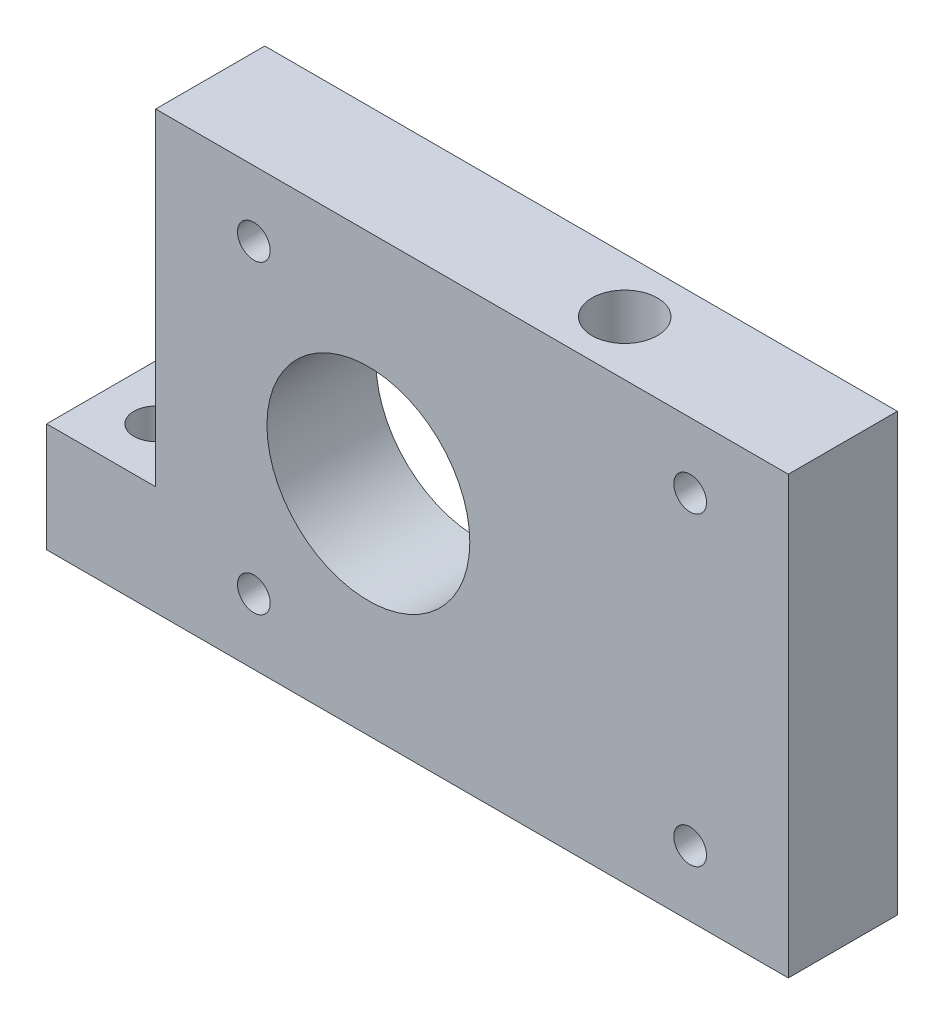
ISO-10303-21;
HEADER;
FILE_DESCRIPTION(('STEP AP214'),'2;1');
FILE_NAME('part.step','',(''),(''),'','','');
FILE_SCHEMA(('AUTOMOTIVE_DESIGN { 1 0 10303 214 1 1 1 1 }'));
ENDSEC;
DATA;
#1=APPLICATION_CONTEXT('core data for automotive mechanical design processes');
#2=APPLICATION_PROTOCOL_DEFINITION('international standard','automotive_design',2000,#1);
#3=PRODUCT_CONTEXT('',#1,'mechanical');
#4=PRODUCT('Part','Part','',(#3));
#5=PRODUCT_RELATED_PRODUCT_CATEGORY('part','',(#4));
#6=PRODUCT_DEFINITION_FORMATION('','',#4);
#7=PRODUCT_DEFINITION_CONTEXT('part definition',#1,'design');
#8=PRODUCT_DEFINITION('design','',#6,#7);
#9=PRODUCT_DEFINITION_SHAPE('','',#8);
#10=(LENGTH_UNIT() NAMED_UNIT(*) SI_UNIT(.MILLI.,.METRE.));
#11=(NAMED_UNIT(*) PLANE_ANGLE_UNIT() SI_UNIT($,.RADIAN.));
#12=(NAMED_UNIT(*) SI_UNIT($,.STERADIAN.) SOLID_ANGLE_UNIT());
#13=UNCERTAINTY_MEASURE_WITH_UNIT(LENGTH_MEASURE(1.E-05),#10,'distance_accuracy_value','');
#14=(GEOMETRIC_REPRESENTATION_CONTEXT(3) GLOBAL_UNCERTAINTY_ASSIGNED_CONTEXT((#13)) GLOBAL_UNIT_ASSIGNED_CONTEXT((#10,
#11,#12)) REPRESENTATION_CONTEXT('',''));
#15=CARTESIAN_POINT('',(0.,0.,0.));
#16=DIRECTION('',(0.,0.,1.));
#17=DIRECTION('',(1.,0.,0.));
#18=AXIS2_PLACEMENT_3D('',#15,#16,#17);
#19=CARTESIAN_POINT('',(-49.,7.8359502095322,21.0924178005195));
#20=DIRECTION('',(0.,0.,-1.));
#21=DIRECTION('',(-1.,0.,0.));
#22=AXIS2_PLACEMENT_3D('',#19,#20,#21);
#23=CYLINDRICAL_SURFACE('',#22,3.9);
#24=CARTESIAN_POINT('',(-49.,7.8359502095322,0.));
#25=DIRECTION('',(0.,0.,1.));
#26=DIRECTION('',(1.,0.,0.));
#27=AXIS2_PLACEMENT_3D('',#24,#25,#26);
#28=CIRCLE('',#27,3.9);
#29=CARTESIAN_POINT('',(-45.1,7.8359502095322,0.));
#30=VERTEX_POINT('',#29);
#31=EDGE_CURVE('E278',#30,#30,#28,.T.);
#32=ORIENTED_EDGE('',*,*,#31,.T.);
#33=EDGE_LOOP('',(#32));
#34=FACE_BOUND('',#33,.T.);
#35=CARTESIAN_POINT('',(-49.,7.8359502095322,0.0615520140093105));
#36=DIRECTION('',(0.,0.,1.));
#37=DIRECTION('',(1.,0.,0.));
#38=AXIS2_PLACEMENT_3D('',#35,#36,#37);
#39=CIRCLE('',#38,3.9);
#40=CARTESIAN_POINT('',(-45.1,7.8359502095322,0.061552014009314));
#41=VERTEX_POINT('',#40);
#42=EDGE_CURVE('E12',#41,#41,#39,.T.);
#43=ORIENTED_EDGE('',*,*,#42,.F.);
#44=EDGE_LOOP('',(#43));
#45=FACE_BOUND('',#44,.T.);
#46=ADVANCED_FACE('F110',(#34,#45),#23,.T.);
#47=CARTESIAN_POINT('',(-49.,7.8359502095322,0.));
#48=DIRECTION('',(0.,0.,1.));
#49=DIRECTION('',(1.,0.,0.));
#50=AXIS2_PLACEMENT_3D('',#47,#48,#49);
#51=PLANE('',#50);
#52=ORIENTED_EDGE('',*,*,#31,.F.);
#53=EDGE_LOOP('',(#52));
#54=FACE_BOUND('',#53,.T.);
#55=CARTESIAN_POINT('',(-49.,7.8359502095322,0.));
#56=DIRECTION('',(0.,0.,1.));
#57=DIRECTION('',(1.,0.,0.));
#58=AXIS2_PLACEMENT_3D('',#55,#56,#57);
#59=CIRCLE('',#58,1.5);
#60=CARTESIAN_POINT('',(-47.5,7.8359502095322,0.));
#61=VERTEX_POINT('',#60);
#62=EDGE_CURVE('E274',#61,#61,#59,.T.);
#63=ORIENTED_EDGE('',*,*,#62,.T.);
#64=EDGE_LOOP('',(#63));
#65=FACE_BOUND('',#64,.T.);
#66=ADVANCED_FACE('F291',(#54,#65),#51,.F.);
#67=CARTESIAN_POINT('',(-49.,7.8359502095322,21.0924178005195));
#68=DIRECTION('',(0.,0.,-1.));
#69=DIRECTION('',(-1.,0.,0.));
#70=AXIS2_PLACEMENT_3D('',#67,#68,#69);
#71=CYLINDRICAL_SURFACE('',#70,1.5);
#72=CARTESIAN_POINT('',(-49.,7.8359502095322,10.0615520140093));
#73=DIRECTION('',(0.,0.,-1.));
#74=DIRECTION('',(-1.,0.,0.));
#75=AXIS2_PLACEMENT_3D('',#72,#73,#74);
#76=CIRCLE('',#75,1.5);
#77=CARTESIAN_POINT('',(-50.5,7.8359502095322,10.0615520140093));
#78=VERTEX_POINT('',#77);
#79=EDGE_CURVE('E119',#78,#78,#76,.T.);
#80=ORIENTED_EDGE('',*,*,#79,.F.);
#81=EDGE_LOOP('',(#80));
#82=FACE_BOUND('',#81,.T.);
#83=ORIENTED_EDGE('',*,*,#62,.F.);
#84=EDGE_LOOP('',(#83));
#85=FACE_BOUND('',#84,.T.);
#86=ADVANCED_FACE('F288',(#82,#85),#71,.F.);
#87=CARTESIAN_POINT('',(59.0127496167088,10.0697952356252,10.0615520140094));
#88=DIRECTION('',(0.,0.,-1.));
#89=DIRECTION('',(0.906307787036651,0.422618261740697,0.));
#90=AXIS2_PLACEMENT_3D('',#87,#88,#89);
#91=PLANE('',#90);
#92=ORIENTED_EDGE('',*,*,#79,.T.);
#93=EDGE_LOOP('',(#92));
#94=FACE_BOUND('',#93,.T.);
#95=DIRECTION('',(1.,0.,0.));
#96=VECTOR('',#95,1.);
#97=CARTESIAN_POINT('',(59.0127496167088,1.83595020953221,10.0615520140094));
#98=LINE('',#97,#96);
#99=CARTESIAN_POINT('',(-68.,1.83595020952963,10.0615520140094));
#100=VERTEX_POINT('',#99);
#101=CARTESIAN_POINT('',(0.,1.8359502095322,10.0615520140094));
#102=VERTEX_POINT('',#101);
#103=EDGE_CURVE('E255',#100,#102,#98,.T.);
#104=ORIENTED_EDGE('',*,*,#103,.T.);
#105=DIRECTION('',(0.,1.,0.));
#106=VECTOR('',#105,1.);
#107=CARTESIAN_POINT('',(0.,10.0697952356252,10.0615520140094));
#108=LINE('',#107,#106);
#109=CARTESIAN_POINT('',(0.,41.8359502095322,10.0615520140094));
#110=VERTEX_POINT('',#109);
#111=EDGE_CURVE('E267',#102,#110,#108,.T.);
#112=ORIENTED_EDGE('',*,*,#111,.T.);
#113=DIRECTION('',(-1.,0.,0.));
#114=VECTOR('',#113,1.);
#115=CARTESIAN_POINT('',(59.0127496167088,41.8359502095322,10.0615520140094));
#116=LINE('',#115,#114);
#117=CARTESIAN_POINT('',(-58.,41.8359502095322,10.0615520140093));
#118=VERTEX_POINT('',#117);
#119=EDGE_CURVE('E270',#110,#118,#116,.T.);
#120=ORIENTED_EDGE('',*,*,#119,.T.);
#121=DIRECTION('',(0.,-1.,0.));
#122=VECTOR('',#121,1.);
#123=CARTESIAN_POINT('',(-58.,10.0697952356252,10.0615520140093));
#124=LINE('',#123,#122);
#125=CARTESIAN_POINT('',(-58.,11.8359502095296,10.0615520140093));
#126=VERTEX_POINT('',#125);
#127=EDGE_CURVE('E262',#118,#126,#124,.T.);
#128=ORIENTED_EDGE('',*,*,#127,.T.);
#129=DIRECTION('',(1.,0.,0.));
#130=VECTOR('',#129,1.);
#131=CARTESIAN_POINT('',(-58.,11.8359502095296,10.0615520140094));
#132=LINE('',#131,#130);
#133=CARTESIAN_POINT('',(-68.,11.8359502095296,10.0615520140094));
#134=VERTEX_POINT('',#133);
#135=EDGE_CURVE('E190',#134,#126,#132,.T.);
#136=ORIENTED_EDGE('',*,*,#135,.F.);
#137=DIRECTION('',(0.,-1.,0.));
#138=VECTOR('',#137,1.);
#139=CARTESIAN_POINT('',(-68.,11.8359502095296,10.0615520140094));
#140=LINE('',#139,#138);
#141=EDGE_CURVE('E201',#134,#100,#140,.T.);
#142=ORIENTED_EDGE('',*,*,#141,.T.);
#143=EDGE_LOOP('',(#104,#112,#120,#128,#136,#142));
#144=FACE_BOUND('',#143,.T.);
#145=CARTESIAN_POINT('',(-38.5,21.8359502095322,10.0615520140093));
#146=DIRECTION('',(0.,0.,-1.));
#147=DIRECTION('',(-1.,0.,0.));
#148=AXIS2_PLACEMENT_3D('',#145,#146,#147);
#149=CIRCLE('',#148,9.3);
#150=CARTESIAN_POINT('',(-47.8,21.8359502095322,10.0615520140093));
#151=VERTEX_POINT('',#150);
#152=EDGE_CURVE('E251',#151,#151,#149,.T.);
#153=ORIENTED_EDGE('',*,*,#152,.T.);
#154=EDGE_LOOP('',(#153));
#155=FACE_BOUND('',#154,.T.);
#156=CARTESIAN_POINT('',(-49.,35.8359502095322,10.0615520140093));
#157=DIRECTION('',(0.,0.,-1.));
#158=DIRECTION('',(-1.,0.,0.));
#159=AXIS2_PLACEMENT_3D('',#156,#157,#158);
#160=CIRCLE('',#159,1.5);
#161=CARTESIAN_POINT('',(-50.5,35.8359502095322,10.0615520140093));
#162=VERTEX_POINT('',#161);
#163=EDGE_CURVE('E237',#162,#162,#160,.T.);
#164=ORIENTED_EDGE('',*,*,#163,.T.);
#165=EDGE_LOOP('',(#164));
#166=FACE_BOUND('',#165,.T.);
#167=CARTESIAN_POINT('',(-9.,35.8359502095322,10.0615520140093));
#168=DIRECTION('',(0.,0.,-1.));
#169=DIRECTION('',(-1.,0.,0.));
#170=AXIS2_PLACEMENT_3D('',#167,#168,#169);
#171=CIRCLE('',#170,1.5);
#172=CARTESIAN_POINT('',(-10.5,35.8359502095322,10.0615520140093));
#173=VERTEX_POINT('',#172);
#174=EDGE_CURVE('E228',#173,#173,#171,.T.);
#175=ORIENTED_EDGE('',*,*,#174,.T.);
#176=EDGE_LOOP('',(#175));
#177=FACE_BOUND('',#176,.T.);
#178=CARTESIAN_POINT('',(-9.,7.8359502095322,10.0615520140093));
#179=DIRECTION('',(0.,0.,-1.));
#180=DIRECTION('',(-1.,0.,0.));
#181=AXIS2_PLACEMENT_3D('',#178,#179,#180);
#182=CIRCLE('',#181,1.5);
#183=CARTESIAN_POINT('',(-10.5,7.8359502095322,10.0615520140093));
#184=VERTEX_POINT('',#183);
#185=EDGE_CURVE('E219',#184,#184,#182,.T.);
#186=ORIENTED_EDGE('',*,*,#185,.T.);
#187=EDGE_LOOP('',(#186));
#188=FACE_BOUND('',#187,.T.);
#189=ADVANCED_FACE('F112',(#94,#144,#155,#166,#177,#188),#91,.F.);
#190=CARTESIAN_POINT('',(0.,0.,0.0615520140093539));
#191=DIRECTION('',(0.,0.,1.));
#192=DIRECTION('',(1.,0.,0.));
#193=AXIS2_PLACEMENT_3D('',#190,#191,#192);
#194=PLANE('',#193);
#195=DIRECTION('',(1.,0.,0.));
#196=VECTOR('',#195,1.);
#197=CARTESIAN_POINT('',(59.0127496167088,1.83595020953221,0.0615520140094059));
#198=LINE('',#197,#196);
#199=CARTESIAN_POINT('',(-68.,1.83595020952963,0.0615520140093031));
#200=VERTEX_POINT('',#199);
#201=CARTESIAN_POINT('',(0.,1.8359502095322,0.0615520140093539));
#202=VERTEX_POINT('',#201);
#203=EDGE_CURVE('E258',#200,#202,#198,.T.);
#204=ORIENTED_EDGE('',*,*,#203,.F.);
#205=DIRECTION('',(0.,-1.,0.));
#206=VECTOR('',#205,1.);
#207=CARTESIAN_POINT('',(-68.,11.8359502095296,0.0615520140093031));
#208=LINE('',#207,#206);
#209=CARTESIAN_POINT('',(-68.,11.8359502095296,0.0615520140093031));
#210=VERTEX_POINT('',#209);
#211=EDGE_CURVE('E181',#210,#200,#208,.T.);
#212=ORIENTED_EDGE('',*,*,#211,.F.);
#213=DIRECTION('',(-1.,0.,0.));
#214=VECTOR('',#213,1.);
#215=CARTESIAN_POINT('',(-58.,11.8359502095296,0.0615520140093018));
#216=LINE('',#215,#214);
#217=CARTESIAN_POINT('',(-58.,11.8359502095296,0.0615520140093018));
#218=VERTEX_POINT('',#217);
#219=EDGE_CURVE('E177',#218,#210,#216,.T.);
#220=ORIENTED_EDGE('',*,*,#219,.F.);
#221=DIRECTION('',(0.,-1.,0.));
#222=VECTOR('',#221,1.);
#223=CARTESIAN_POINT('',(-58.,10.0697952356252,0.0615520140093018));
#224=LINE('',#223,#222);
#225=CARTESIAN_POINT('',(-58.,41.8359502095322,0.0615520140093001));
#226=VERTEX_POINT('',#225);
#227=EDGE_CURVE('E169',#226,#218,#224,.T.);
#228=ORIENTED_EDGE('',*,*,#227,.F.);
#229=DIRECTION('',(-1.,0.,0.));
#230=VECTOR('',#229,1.);
#231=CARTESIAN_POINT('',(59.0127496167088,41.8359502095322,0.0615520140094042));
#232=LINE('',#231,#230);
#233=CARTESIAN_POINT('',(0.,41.8359502095322,0.0615520140093521));
#234=VERTEX_POINT('',#233);
#235=EDGE_CURVE('E174',#234,#226,#232,.T.);
#236=ORIENTED_EDGE('',*,*,#235,.F.);
#237=DIRECTION('',(0.,1.,0.));
#238=VECTOR('',#237,1.);
#239=CARTESIAN_POINT('',(0.,10.0697952356252,0.0615520140093539));
#240=LINE('',#239,#238);
#241=EDGE_CURVE('E261',#202,#234,#240,.T.);
#242=ORIENTED_EDGE('',*,*,#241,.F.);
#243=EDGE_LOOP('',(#204,#212,#220,#228,#236,#242));
#244=FACE_BOUND('',#243,.T.);
#245=CARTESIAN_POINT('',(-38.5,21.8359502095322,0.0615520140093192));
#246=DIRECTION('',(0.,0.,-1.));
#247=DIRECTION('',(-1.,0.,0.));
#248=AXIS2_PLACEMENT_3D('',#245,#246,#247);
#249=CIRCLE('',#248,9.3);
#250=CARTESIAN_POINT('',(-47.8,21.8359502095322,0.0615520140093109));
#251=VERTEX_POINT('',#250);
#252=EDGE_CURVE('E252',#251,#251,#249,.T.);
#253=ORIENTED_EDGE('',*,*,#252,.F.);
#254=EDGE_LOOP('',(#253));
#255=FACE_BOUND('',#254,.T.);
#256=CARTESIAN_POINT('',(-49.,35.8359502095322,0.0615520140093088));
#257=DIRECTION('',(0.,0.,-1.));
#258=DIRECTION('',(-1.,0.,0.));
#259=AXIS2_PLACEMENT_3D('',#256,#257,#258);
#260=CIRCLE('',#259,3.9);
#261=CARTESIAN_POINT('',(-52.9,35.8359502095322,0.0615520140093053));
#262=VERTEX_POINT('',#261);
#263=EDGE_CURVE('E248',#262,#262,#260,.T.);
#264=ORIENTED_EDGE('',*,*,#263,.F.);
#265=EDGE_LOOP('',(#264));
#266=FACE_BOUND('',#265,.T.);
#267=ORIENTED_EDGE('',*,*,#42,.T.);
#268=EDGE_LOOP('',(#267));
#269=FACE_BOUND('',#268,.T.);
#270=CARTESIAN_POINT('',(-9.00000000000001,35.8359502095322,0.0615520140093452));
#271=DIRECTION('',(0.,0.,-1.));
#272=DIRECTION('',(-1.,0.,0.));
#273=AXIS2_PLACEMENT_3D('',#270,#271,#272);
#274=CIRCLE('',#273,3.9);
#275=CARTESIAN_POINT('',(-12.9,35.8359502095322,0.0615520140093417));
#276=VERTEX_POINT('',#275);
#277=EDGE_CURVE('E245',#276,#276,#274,.T.);
#278=ORIENTED_EDGE('',*,*,#277,.F.);
#279=EDGE_LOOP('',(#278));
#280=FACE_BOUND('',#279,.T.);
#281=CARTESIAN_POINT('',(-8.99999999999999,7.83595020953221,0.0615520140093452));
#282=DIRECTION('',(0.,0.,-1.));
#283=DIRECTION('',(-1.,0.,0.));
#284=AXIS2_PLACEMENT_3D('',#281,#282,#283);
#285=CIRCLE('',#284,3.9);
#286=CARTESIAN_POINT('',(-12.9,7.83595020953221,0.0615520140093417));
#287=VERTEX_POINT('',#286);
#288=EDGE_CURVE('E242',#287,#287,#285,.T.);
#289=ORIENTED_EDGE('',*,*,#288,.F.);
#290=EDGE_LOOP('',(#289));
#291=FACE_BOUND('',#290,.T.);
#292=ADVANCED_FACE('F178',(#244,#255,#266,#269,#280,#291),#194,.F.);
#293=CARTESIAN_POINT('',(59.0127496167088,1.83595020953221,0.0615520140094059));
#294=DIRECTION('',(0.,-1.,0.));
#295=DIRECTION('',(1.,0.,0.));
#296=AXIS2_PLACEMENT_3D('',#293,#294,#295);
#297=PLANE('',#296);
#298=CARTESIAN_POINT('',(-20.,1.83595020953219,5.0615520140093));
#299=DIRECTION('',(0.,1.,0.));
#300=DIRECTION('',(-1.,0.,0.));
#301=AXIS2_PLACEMENT_3D('',#298,#299,#300);
#302=CIRCLE('',#301,2.);
#303=CARTESIAN_POINT('',(-22.,1.83595020953219,5.0615520140093));
#304=VERTEX_POINT('',#303);
#305=EDGE_CURVE('E206',#304,#304,#302,.T.);
#306=ORIENTED_EDGE('',*,*,#305,.T.);
#307=EDGE_LOOP('',(#306));
#308=FACE_BOUND('',#307,.T.);
#309=ORIENTED_EDGE('',*,*,#103,.F.);
#310=DIRECTION('',(0.,0.,1.));
#311=VECTOR('',#310,1.);
#312=CARTESIAN_POINT('',(-68.,1.83595020952963,0.0615520140093031));
#313=LINE('',#312,#311);
#314=EDGE_CURVE('E191',#200,#100,#313,.T.);
#315=ORIENTED_EDGE('',*,*,#314,.F.);
#316=ORIENTED_EDGE('',*,*,#203,.T.);
#317=DIRECTION('',(0.,0.,1.));
#318=VECTOR('',#317,1.);
#319=CARTESIAN_POINT('',(0.,1.8359502095322,0.0615520140093539));
#320=LINE('',#319,#318);
#321=EDGE_CURVE('E153',#202,#102,#320,.T.);
#322=ORIENTED_EDGE('',*,*,#321,.T.);
#323=EDGE_LOOP('',(#309,#315,#316,#322));
#324=FACE_BOUND('',#323,.T.);
#325=CARTESIAN_POINT('',(-63.,1.83595020952963,5.06155201400933));
#326=DIRECTION('',(0.,1.,0.));
#327=DIRECTION('',(-1.,0.,0.));
#328=AXIS2_PLACEMENT_3D('',#325,#326,#327);
#329=CIRCLE('',#328,2.);
#330=CARTESIAN_POINT('',(-65.,1.83595020952963,5.06155201400933));
#331=VERTEX_POINT('',#330);
#332=EDGE_CURVE('E197',#331,#331,#329,.T.);
#333=ORIENTED_EDGE('',*,*,#332,.T.);
#334=EDGE_LOOP('',(#333));
#335=FACE_BOUND('',#334,.T.);
#336=ADVANCED_FACE('F304',(#308,#324,#335),#297,.T.);
#337=CARTESIAN_POINT('',(-58.,10.0697952356252,0.0615520140093018));
#338=DIRECTION('',(-1.,0.,0.));
#339=DIRECTION('',(0.,-1.,0.));
#340=AXIS2_PLACEMENT_3D('',#337,#338,#339);
#341=PLANE('',#340);
#342=DIRECTION('',(0.,0.,-1.));
#343=VECTOR('',#342,1.);
#344=CARTESIAN_POINT('',(-58.,11.8359502095296,0.0615520140093018));
#345=LINE('',#344,#343);
#346=EDGE_CURVE('E126',#126,#218,#345,.T.);
#347=ORIENTED_EDGE('',*,*,#346,.F.);
#348=ORIENTED_EDGE('',*,*,#127,.F.);
#349=DIRECTION('',(0.,0.,1.));
#350=VECTOR('',#349,1.);
#351=CARTESIAN_POINT('',(-58.,41.8359502095322,0.0615520140093001));
#352=LINE('',#351,#350);
#353=EDGE_CURVE('E132',#226,#118,#352,.T.);
#354=ORIENTED_EDGE('',*,*,#353,.F.);
#355=ORIENTED_EDGE('',*,*,#227,.T.);
#356=EDGE_LOOP('',(#347,#348,#354,#355));
#357=FACE_BOUND('',#356,.T.);
#358=ADVANCED_FACE('F171',(#357),#341,.T.);
#359=CARTESIAN_POINT('',(59.0127496167088,41.8359502095322,0.0615520140094042));
#360=DIRECTION('',(0.,1.,0.));
#361=DIRECTION('',(-1.,0.,0.));
#362=AXIS2_PLACEMENT_3D('',#359,#360,#361);
#363=PLANE('',#362);
#364=CARTESIAN_POINT('',(-20.,41.8359502095322,5.0615520140093));
#365=DIRECTION('',(0.,1.,0.));
#366=DIRECTION('',(-1.,0.,0.));
#367=AXIS2_PLACEMENT_3D('',#364,#365,#366);
#368=CIRCLE('',#367,3.);
#369=CARTESIAN_POINT('',(-23.,41.8359502095322,5.0615520140093));
#370=VERTEX_POINT('',#369);
#371=EDGE_CURVE('E213',#370,#370,#368,.T.);
#372=ORIENTED_EDGE('',*,*,#371,.F.);
#373=EDGE_LOOP('',(#372));
#374=FACE_BOUND('',#373,.T.);
#375=ORIENTED_EDGE('',*,*,#119,.F.);
#376=DIRECTION('',(0.,0.,1.));
#377=VECTOR('',#376,1.);
#378=CARTESIAN_POINT('',(0.,41.8359502095322,0.0615520140093521));
#379=LINE('',#378,#377);
#380=EDGE_CURVE('E275',#234,#110,#379,.T.);
#381=ORIENTED_EDGE('',*,*,#380,.F.);
#382=ORIENTED_EDGE('',*,*,#235,.T.);
#383=ORIENTED_EDGE('',*,*,#353,.T.);
#384=EDGE_LOOP('',(#375,#381,#382,#383));
#385=FACE_BOUND('',#384,.T.);
#386=ADVANCED_FACE('F312',(#374,#385),#363,.T.);
#387=CARTESIAN_POINT('',(0.,10.0697952356252,0.0615520140093539));
#388=DIRECTION('',(1.,0.,0.));
#389=DIRECTION('',(0.,1.,0.));
#390=AXIS2_PLACEMENT_3D('',#387,#388,#389);
#391=PLANE('',#390);
#392=ORIENTED_EDGE('',*,*,#111,.F.);
#393=ORIENTED_EDGE('',*,*,#321,.F.);
#394=ORIENTED_EDGE('',*,*,#241,.T.);
#395=ORIENTED_EDGE('',*,*,#380,.T.);
#396=EDGE_LOOP('',(#392,#393,#394,#395));
#397=FACE_BOUND('',#396,.T.);
#398=ADVANCED_FACE('F308',(#397),#391,.T.);
#399=CARTESIAN_POINT('',(-38.5,21.8359502095322,0.0615520140093192));
#400=DIRECTION('',(0.,0.,1.));
#401=DIRECTION('',(1.,0.,0.));
#402=AXIS2_PLACEMENT_3D('',#399,#400,#401);
#403=CYLINDRICAL_SURFACE('',#402,9.3);
#404=ORIENTED_EDGE('',*,*,#252,.T.);
#405=EDGE_LOOP('',(#404));
#406=FACE_BOUND('',#405,.T.);
#407=ORIENTED_EDGE('',*,*,#152,.F.);
#408=EDGE_LOOP('',(#407));
#409=FACE_BOUND('',#408,.T.);
#410=ADVANCED_FACE('F311',(#406,#409),#403,.F.);
#411=CARTESIAN_POINT('',(-49.,35.8359502095322,21.0924178005195));
#412=DIRECTION('',(0.,0.,-1.));
#413=DIRECTION('',(-1.,0.,0.));
#414=AXIS2_PLACEMENT_3D('',#411,#412,#413);
#415=CYLINDRICAL_SURFACE('',#414,3.9);
#416=CARTESIAN_POINT('',(-49.,35.8359502095322,0.));
#417=DIRECTION('',(0.,0.,1.));
#418=DIRECTION('',(1.,0.,0.));
#419=AXIS2_PLACEMENT_3D('',#416,#417,#418);
#420=CIRCLE('',#419,3.9);
#421=CARTESIAN_POINT('',(-45.1,35.8359502095322,0.));
#422=VERTEX_POINT('',#421);
#423=EDGE_CURVE('E234',#422,#422,#420,.T.);
#424=ORIENTED_EDGE('',*,*,#423,.T.);
#425=EDGE_LOOP('',(#424));
#426=FACE_BOUND('',#425,.T.);
#427=ORIENTED_EDGE('',*,*,#263,.T.);
#428=EDGE_LOOP('',(#427));
#429=FACE_BOUND('',#428,.T.);
#430=ADVANCED_FACE('F322',(#426,#429),#415,.T.);
#431=CARTESIAN_POINT('',(-49.,35.8359502095322,0.));
#432=DIRECTION('',(0.,0.,1.));
#433=DIRECTION('',(1.,0.,0.));
#434=AXIS2_PLACEMENT_3D('',#431,#432,#433);
#435=PLANE('',#434);
#436=ORIENTED_EDGE('',*,*,#423,.F.);
#437=EDGE_LOOP('',(#436));
#438=FACE_BOUND('',#437,.T.);
#439=CARTESIAN_POINT('',(-49.,35.8359502095322,0.));
#440=DIRECTION('',(0.,0.,1.));
#441=DIRECTION('',(1.,0.,0.));
#442=AXIS2_PLACEMENT_3D('',#439,#440,#441);
#443=CIRCLE('',#442,1.5);
#444=CARTESIAN_POINT('',(-47.5,35.8359502095322,0.));
#445=VERTEX_POINT('',#444);
#446=EDGE_CURVE('E233',#445,#445,#443,.T.);
#447=ORIENTED_EDGE('',*,*,#446,.T.);
#448=EDGE_LOOP('',(#447));
#449=FACE_BOUND('',#448,.T.);
#450=ADVANCED_FACE('F328',(#438,#449),#435,.F.);
#451=CARTESIAN_POINT('',(-49.,35.8359502095322,21.0924178005195));
#452=DIRECTION('',(0.,0.,-1.));
#453=DIRECTION('',(-1.,0.,0.));
#454=AXIS2_PLACEMENT_3D('',#451,#452,#453);
#455=CYLINDRICAL_SURFACE('',#454,1.5);
#456=ORIENTED_EDGE('',*,*,#163,.F.);
#457=EDGE_LOOP('',(#456));
#458=FACE_BOUND('',#457,.T.);
#459=ORIENTED_EDGE('',*,*,#446,.F.);
#460=EDGE_LOOP('',(#459));
#461=FACE_BOUND('',#460,.T.);
#462=ADVANCED_FACE('F324',(#458,#461),#455,.F.);
#463=CARTESIAN_POINT('',(-9.,35.8359502095322,21.0924178005195));
#464=DIRECTION('',(0.,0.,-1.));
#465=DIRECTION('',(-1.,0.,0.));
#466=AXIS2_PLACEMENT_3D('',#463,#464,#465);
#467=CYLINDRICAL_SURFACE('',#466,3.9);
#468=CARTESIAN_POINT('',(-9.,35.8359502095322,0.));
#469=DIRECTION('',(0.,0.,1.));
#470=DIRECTION('',(1.,0.,0.));
#471=AXIS2_PLACEMENT_3D('',#468,#469,#470);
#472=CIRCLE('',#471,3.9);
#473=CARTESIAN_POINT('',(-5.1,35.8359502095322,0.));
#474=VERTEX_POINT('',#473);
#475=EDGE_CURVE('E225',#474,#474,#472,.T.);
#476=ORIENTED_EDGE('',*,*,#475,.T.);
#477=EDGE_LOOP('',(#476));
#478=FACE_BOUND('',#477,.T.);
#479=ORIENTED_EDGE('',*,*,#277,.T.);
#480=EDGE_LOOP('',(#479));
#481=FACE_BOUND('',#480,.T.);
#482=ADVANCED_FACE('F327',(#478,#481),#467,.T.);
#483=CARTESIAN_POINT('',(-9.,35.8359502095322,0.));
#484=DIRECTION('',(0.,0.,1.));
#485=DIRECTION('',(1.,0.,0.));
#486=AXIS2_PLACEMENT_3D('',#483,#484,#485);
#487=PLANE('',#486);
#488=ORIENTED_EDGE('',*,*,#475,.F.);
#489=EDGE_LOOP('',(#488));
#490=FACE_BOUND('',#489,.T.);
#491=CARTESIAN_POINT('',(-9.,35.8359502095322,0.));
#492=DIRECTION('',(0.,0.,1.));
#493=DIRECTION('',(1.,0.,0.));
#494=AXIS2_PLACEMENT_3D('',#491,#492,#493);
#495=CIRCLE('',#494,1.5);
#496=CARTESIAN_POINT('',(-7.5,35.8359502095322,0.));
#497=VERTEX_POINT('',#496);
#498=EDGE_CURVE('E224',#497,#497,#495,.T.);
#499=ORIENTED_EDGE('',*,*,#498,.T.);
#500=EDGE_LOOP('',(#499));
#501=FACE_BOUND('',#500,.T.);
#502=ADVANCED_FACE('F340',(#490,#501),#487,.F.);
#503=CARTESIAN_POINT('',(-9.,35.8359502095322,21.0924178005195));
#504=DIRECTION('',(0.,0.,-1.));
#505=DIRECTION('',(-1.,0.,0.));
#506=AXIS2_PLACEMENT_3D('',#503,#504,#505);
#507=CYLINDRICAL_SURFACE('',#506,1.5);
#508=ORIENTED_EDGE('',*,*,#174,.F.);
#509=EDGE_LOOP('',(#508));
#510=FACE_BOUND('',#509,.T.);
#511=ORIENTED_EDGE('',*,*,#498,.F.);
#512=EDGE_LOOP('',(#511));
#513=FACE_BOUND('',#512,.T.);
#514=ADVANCED_FACE('F336',(#510,#513),#507,.F.);
#515=CARTESIAN_POINT('',(-9.,7.8359502095322,21.0924178005195));
#516=DIRECTION('',(0.,0.,-1.));
#517=DIRECTION('',(-1.,0.,0.));
#518=AXIS2_PLACEMENT_3D('',#515,#516,#517);
#519=CYLINDRICAL_SURFACE('',#518,3.9);
#520=CARTESIAN_POINT('',(-9.,7.8359502095322,0.));
#521=DIRECTION('',(0.,0.,1.));
#522=DIRECTION('',(1.,0.,0.));
#523=AXIS2_PLACEMENT_3D('',#520,#521,#522);
#524=CIRCLE('',#523,3.9);
#525=CARTESIAN_POINT('',(-5.1,7.8359502095322,0.));
#526=VERTEX_POINT('',#525);
#527=EDGE_CURVE('E216',#526,#526,#524,.T.);
#528=ORIENTED_EDGE('',*,*,#527,.T.);
#529=EDGE_LOOP('',(#528));
#530=FACE_BOUND('',#529,.T.);
#531=ORIENTED_EDGE('',*,*,#288,.T.);
#532=EDGE_LOOP('',(#531));
#533=FACE_BOUND('',#532,.T.);
#534=ADVANCED_FACE('F339',(#530,#533),#519,.T.);
#535=CARTESIAN_POINT('',(-9.,7.8359502095322,0.));
#536=DIRECTION('',(0.,0.,1.));
#537=DIRECTION('',(1.,0.,0.));
#538=AXIS2_PLACEMENT_3D('',#535,#536,#537);
#539=PLANE('',#538);
#540=ORIENTED_EDGE('',*,*,#527,.F.);
#541=EDGE_LOOP('',(#540));
#542=FACE_BOUND('',#541,.T.);
#543=CARTESIAN_POINT('',(-9.,7.8359502095322,0.));
#544=DIRECTION('',(0.,0.,1.));
#545=DIRECTION('',(1.,0.,0.));
#546=AXIS2_PLACEMENT_3D('',#543,#544,#545);
#547=CIRCLE('',#546,1.5);
#548=CARTESIAN_POINT('',(-7.5,7.8359502095322,0.));
#549=VERTEX_POINT('',#548);
#550=EDGE_CURVE('E212',#549,#549,#547,.T.);
#551=ORIENTED_EDGE('',*,*,#550,.T.);
#552=EDGE_LOOP('',(#551));
#553=FACE_BOUND('',#552,.T.);
#554=ADVANCED_FACE('F352',(#542,#553),#539,.F.);
#555=CARTESIAN_POINT('',(-9.,7.8359502095322,21.0924178005195));
#556=DIRECTION('',(0.,0.,-1.));
#557=DIRECTION('',(-1.,0.,0.));
#558=AXIS2_PLACEMENT_3D('',#555,#556,#557);
#559=CYLINDRICAL_SURFACE('',#558,1.5);
#560=ORIENTED_EDGE('',*,*,#185,.F.);
#561=EDGE_LOOP('',(#560));
#562=FACE_BOUND('',#561,.T.);
#563=ORIENTED_EDGE('',*,*,#550,.F.);
#564=EDGE_LOOP('',(#563));
#565=FACE_BOUND('',#564,.T.);
#566=ADVANCED_FACE('F348',(#562,#565),#559,.F.);
#567=CARTESIAN_POINT('',(-20.,16.8359502095322,5.0615520140093));
#568=DIRECTION('',(0.,1.,0.));
#569=DIRECTION('',(-1.,0.,0.));
#570=AXIS2_PLACEMENT_3D('',#567,#568,#569);
#571=CYLINDRICAL_SURFACE('',#570,3.);
#572=CARTESIAN_POINT('',(-20.,16.8359502095322,5.0615520140093));
#573=DIRECTION('',(0.,1.,0.));
#574=DIRECTION('',(-1.,0.,0.));
#575=AXIS2_PLACEMENT_3D('',#572,#573,#574);
#576=CIRCLE('',#575,3.);
#577=CARTESIAN_POINT('',(-23.,16.8359502095322,5.0615520140093));
#578=VERTEX_POINT('',#577);
#579=EDGE_CURVE('E209',#578,#578,#576,.T.);
#580=ORIENTED_EDGE('',*,*,#579,.F.);
#581=EDGE_LOOP('',(#580));
#582=FACE_BOUND('',#581,.T.);
#583=ORIENTED_EDGE('',*,*,#371,.T.);
#584=EDGE_LOOP('',(#583));
#585=FACE_BOUND('',#584,.T.);
#586=ADVANCED_FACE('F351',(#582,#585),#571,.F.);
#587=CARTESIAN_POINT('',(0.,16.8359502095322,0.));
#588=DIRECTION('',(0.,1.,0.));
#589=DIRECTION('',(-1.,0.,0.));
#590=AXIS2_PLACEMENT_3D('',#587,#588,#589);
#591=PLANE('',#590);
#592=CARTESIAN_POINT('',(-20.,16.8359502095322,5.0615520140093));
#593=DIRECTION('',(0.,1.,0.));
#594=DIRECTION('',(-1.,0.,0.));
#595=AXIS2_PLACEMENT_3D('',#592,#593,#594);
#596=CIRCLE('',#595,2.);
#597=CARTESIAN_POINT('',(-22.,16.8359502095322,5.0615520140093));
#598=VERTEX_POINT('',#597);
#599=EDGE_CURVE('E114',#598,#598,#596,.T.);
#600=ORIENTED_EDGE('',*,*,#599,.F.);
#601=EDGE_LOOP('',(#600));
#602=FACE_BOUND('',#601,.T.);
#603=ORIENTED_EDGE('',*,*,#579,.T.);
#604=EDGE_LOOP('',(#603));
#605=FACE_BOUND('',#604,.T.);
#606=ADVANCED_FACE('F362',(#602,#605),#591,.T.);
#607=CARTESIAN_POINT('',(-20.,1.83595020953219,5.0615520140093));
#608=DIRECTION('',(0.,1.,0.));
#609=DIRECTION('',(-1.,0.,0.));
#610=AXIS2_PLACEMENT_3D('',#607,#608,#609);
#611=CYLINDRICAL_SURFACE('',#610,2.);
#612=ORIENTED_EDGE('',*,*,#599,.T.);
#613=EDGE_LOOP('',(#612));
#614=FACE_BOUND('',#613,.T.);
#615=ORIENTED_EDGE('',*,*,#305,.F.);
#616=EDGE_LOOP('',(#615));
#617=FACE_BOUND('',#616,.T.);
#618=ADVANCED_FACE('F366',(#614,#617),#611,.F.);
#619=CARTESIAN_POINT('',(0.,11.8359502095296,0.));
#620=DIRECTION('',(0.,-1.,0.));
#621=DIRECTION('',(1.,0.,0.));
#622=AXIS2_PLACEMENT_3D('',#619,#620,#621);
#623=PLANE('',#622);
#624=ORIENTED_EDGE('',*,*,#346,.T.);
#625=ORIENTED_EDGE('',*,*,#219,.T.);
#626=DIRECTION('',(0.,0.,1.));
#627=VECTOR('',#626,1.);
#628=CARTESIAN_POINT('',(-68.,11.8359502095296,0.0615520140093031));
#629=LINE('',#628,#627);
#630=EDGE_CURVE('E184',#210,#134,#629,.T.);
#631=ORIENTED_EDGE('',*,*,#630,.T.);
#632=ORIENTED_EDGE('',*,*,#135,.T.);
#633=EDGE_LOOP('',(#624,#625,#631,#632));
#634=FACE_BOUND('',#633,.T.);
#635=CARTESIAN_POINT('',(-63.,11.8359502095296,5.06155201400933));
#636=DIRECTION('',(0.,1.,0.));
#637=DIRECTION('',(-1.,0.,0.));
#638=AXIS2_PLACEMENT_3D('',#635,#636,#637);
#639=CIRCLE('',#638,2.);
#640=CARTESIAN_POINT('',(-65.,11.8359502095296,5.06155201400933));
#641=VERTEX_POINT('',#640);
#642=EDGE_CURVE('E194',#641,#641,#639,.T.);
#643=ORIENTED_EDGE('',*,*,#642,.F.);
#644=EDGE_LOOP('',(#643));
#645=FACE_BOUND('',#644,.T.);
#646=ADVANCED_FACE('F187',(#634,#645),#623,.F.);
#647=CARTESIAN_POINT('',(-68.,11.8359502095296,0.0615520140093031));
#648=DIRECTION('',(1.,0.,0.));
#649=DIRECTION('',(0.,1.,0.));
#650=AXIS2_PLACEMENT_3D('',#647,#648,#649);
#651=PLANE('',#650);
#652=ORIENTED_EDGE('',*,*,#314,.T.);
#653=ORIENTED_EDGE('',*,*,#141,.F.);
#654=ORIENTED_EDGE('',*,*,#630,.F.);
#655=ORIENTED_EDGE('',*,*,#211,.T.);
#656=EDGE_LOOP('',(#652,#653,#654,#655));
#657=FACE_BOUND('',#656,.T.);
#658=ADVANCED_FACE('F371',(#657),#651,.F.);
#659=CARTESIAN_POINT('',(-63.,11.8359502095296,5.06155201400933));
#660=DIRECTION('',(0.,-1.,0.));
#661=DIRECTION('',(1.,0.,0.));
#662=AXIS2_PLACEMENT_3D('',#659,#660,#661);
#663=CYLINDRICAL_SURFACE('',#662,2.);
#664=ORIENTED_EDGE('',*,*,#642,.T.);
#665=EDGE_LOOP('',(#664));
#666=FACE_BOUND('',#665,.T.);
#667=ORIENTED_EDGE('',*,*,#332,.F.);
#668=EDGE_LOOP('',(#667));
#669=FACE_BOUND('',#668,.T.);
#670=ADVANCED_FACE('F374',(#666,#669),#663,.F.);
#671=CLOSED_SHELL('',(#46,#66,#86,#189,#292,#336,#358,#386,#398,#410,#430,#450,#462,#482,#502,
#514,#534,#554,#566,#586,#606,#618,#646,#658,#670));
#672=MANIFOLD_SOLID_BREP('B2',#671);
#673=ADVANCED_BREP_SHAPE_REPRESENTATION('',(#18,#672),#14);
#674=SHAPE_DEFINITION_REPRESENTATION(#9,#673);
ENDSEC;
END-ISO-10303-21;
